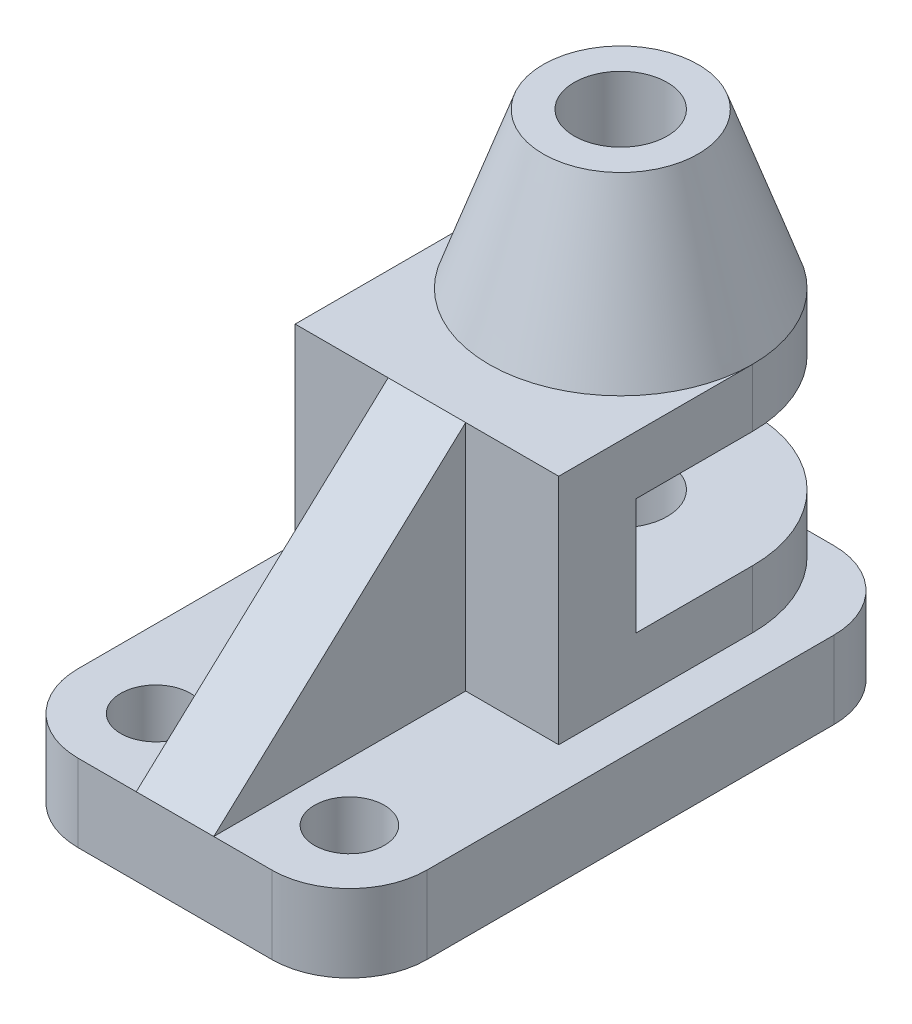
ISO-10303-21;
HEADER;
FILE_DESCRIPTION(('STEP AP214'),'2;1');
FILE_NAME('part.step','',(''),(''),'','','');
FILE_SCHEMA(('AUTOMOTIVE_DESIGN { 1 0 10303 214 1 1 1 1 }'));
ENDSEC;
DATA;
#1=APPLICATION_CONTEXT('core data for automotive mechanical design processes');
#2=APPLICATION_PROTOCOL_DEFINITION('international standard','automotive_design',2000,#1);
#3=PRODUCT_CONTEXT('',#1,'mechanical');
#4=PRODUCT('Part','Part','',(#3));
#5=PRODUCT_RELATED_PRODUCT_CATEGORY('part','',(#4));
#6=PRODUCT_DEFINITION_FORMATION('','',#4);
#7=PRODUCT_DEFINITION_CONTEXT('part definition',#1,'design');
#8=PRODUCT_DEFINITION('design','',#6,#7);
#9=PRODUCT_DEFINITION_SHAPE('','',#8);
#10=(LENGTH_UNIT() NAMED_UNIT(*) SI_UNIT(.MILLI.,.METRE.));
#11=(NAMED_UNIT(*) PLANE_ANGLE_UNIT() SI_UNIT($,.RADIAN.));
#12=(NAMED_UNIT(*) SI_UNIT($,.STERADIAN.) SOLID_ANGLE_UNIT());
#13=UNCERTAINTY_MEASURE_WITH_UNIT(LENGTH_MEASURE(1.E-05),#10,'distance_accuracy_value','');
#14=(GEOMETRIC_REPRESENTATION_CONTEXT(3) GLOBAL_UNCERTAINTY_ASSIGNED_CONTEXT((#13)) GLOBAL_UNIT_ASSIGNED_CONTEXT((#10,
#11,#12)) REPRESENTATION_CONTEXT('',''));
#15=CARTESIAN_POINT('',(0.,0.,0.));
#16=DIRECTION('',(0.,0.,1.));
#17=DIRECTION('',(1.,0.,0.));
#18=AXIS2_PLACEMENT_3D('',#15,#16,#17);
#19=CARTESIAN_POINT('',(0.,10.,0.));
#20=DIRECTION('',(0.,-1.,0.));
#21=DIRECTION('',(0.,0.,-1.));
#22=AXIS2_PLACEMENT_3D('',#19,#20,#21);
#23=PLANE('',#22);
#24=CARTESIAN_POINT('',(-25.,10.,52.5));
#25=DIRECTION('',(0.,-1.,0.));
#26=DIRECTION('',(0.,0.,1.));
#27=AXIS2_PLACEMENT_3D('',#24,#25,#26);
#28=CIRCLE('',#27,9.);
#29=CARTESIAN_POINT('',(-25.,10.,61.5));
#30=VERTEX_POINT('',#29);
#31=EDGE_CURVE('E358',#30,#30,#28,.T.);
#32=ORIENTED_EDGE('',*,*,#31,.T.);
#33=EDGE_LOOP('',(#32));
#34=FACE_BOUND('',#33,.T.);
#35=DIRECTION('',(0.,0.,-1.));
#36=VECTOR('',#35,1.);
#37=CARTESIAN_POINT('',(-10.,10.,72.5));
#38=LINE('',#37,#36);
#39=CARTESIAN_POINT('',(-10.,10.,72.5));
#40=VERTEX_POINT('',#39);
#41=CARTESIAN_POINT('',(-10.,10.,7.49999999999997));
#42=VERTEX_POINT('',#41);
#43=EDGE_CURVE('E343',#40,#42,#38,.T.);
#44=ORIENTED_EDGE('',*,*,#43,.T.);
#45=DIRECTION('',(1.,0.,0.));
#46=VECTOR('',#45,1.);
#47=CARTESIAN_POINT('',(-34.,10.,7.49999999999997));
#48=LINE('',#47,#46);
#49=CARTESIAN_POINT('',(-34.,10.,7.49999999999997));
#50=VERTEX_POINT('',#49);
#51=EDGE_CURVE('E282',#50,#42,#48,.T.);
#52=ORIENTED_EDGE('',*,*,#51,.F.);
#53=DIRECTION('',(0.,0.,1.));
#54=VECTOR('',#53,1.);
#55=CARTESIAN_POINT('',(-34.,10.,7.49999999999997));
#56=LINE('',#55,#54);
#57=CARTESIAN_POINT('',(-34.,10.,-42.5));
#58=VERTEX_POINT('',#57);
#59=EDGE_CURVE('E278',#58,#50,#56,.T.);
#60=ORIENTED_EDGE('',*,*,#59,.F.);
#61=CARTESIAN_POINT('',(0.,10.,-42.5));
#62=DIRECTION('',(0.,1.,0.));
#63=DIRECTION('',(0.,0.,1.));
#64=AXIS2_PLACEMENT_3D('',#61,#62,#63);
#65=CIRCLE('',#64,34.);
#66=CARTESIAN_POINT('',(-16.,10.,-72.5));
#67=VERTEX_POINT('',#66);
#68=EDGE_CURVE('E50',#67,#58,#65,.T.);
#69=ORIENTED_EDGE('',*,*,#68,.F.);
#70=DIRECTION('',(-1.,0.,0.));
#71=VECTOR('',#70,1.);
#72=CARTESIAN_POINT('',(45.,10.,-72.5));
#73=LINE('',#72,#71);
#74=CARTESIAN_POINT('',(-25.,10.,-72.5));
#75=VERTEX_POINT('',#74);
#76=EDGE_CURVE('E233',#67,#75,#73,.T.);
#77=ORIENTED_EDGE('',*,*,#76,.T.);
#78=CARTESIAN_POINT('',(-25.,10.,-52.5));
#79=DIRECTION('',(0.,-1.,0.));
#80=DIRECTION('',(0.,0.,-1.));
#81=AXIS2_PLACEMENT_3D('',#78,#79,#80);
#82=CIRCLE('',#81,20.);
#83=CARTESIAN_POINT('',(-45.,10.,-52.5));
#84=VERTEX_POINT('',#83);
#85=EDGE_CURVE('E256',#75,#84,#82,.F.);
#86=ORIENTED_EDGE('',*,*,#85,.T.);
#87=DIRECTION('',(0.,0.,1.));
#88=VECTOR('',#87,1.);
#89=CARTESIAN_POINT('',(-45.,10.,72.5));
#90=LINE('',#89,#88);
#91=CARTESIAN_POINT('',(-45.,10.,52.5));
#92=VERTEX_POINT('',#91);
#93=EDGE_CURVE('E210',#84,#92,#90,.T.);
#94=ORIENTED_EDGE('',*,*,#93,.T.);
#95=CARTESIAN_POINT('',(-25.,10.,52.5));
#96=DIRECTION('',(0.,-1.,0.));
#97=DIRECTION('',(0.,0.,-1.));
#98=AXIS2_PLACEMENT_3D('',#95,#96,#97);
#99=CIRCLE('',#98,20.);
#100=CARTESIAN_POINT('',(-25.,10.,72.5));
#101=VERTEX_POINT('',#100);
#102=EDGE_CURVE('E252',#92,#101,#99,.F.);
#103=ORIENTED_EDGE('',*,*,#102,.T.);
#104=DIRECTION('',(1.,0.,0.));
#105=VECTOR('',#104,1.);
#106=CARTESIAN_POINT('',(45.,10.,72.5));
#107=LINE('',#106,#105);
#108=EDGE_CURVE('E209',#101,#40,#107,.T.);
#109=ORIENTED_EDGE('',*,*,#108,.T.);
#110=EDGE_LOOP('',(#44,#52,#60,#69,#77,#86,#94,#103,#109));
#111=FACE_BOUND('',#110,.T.);
#112=ADVANCED_FACE('F41',(#34,#111),#23,.F.);
#113=CARTESIAN_POINT('',(-34.,70.,7.49999999999997));
#114=DIRECTION('',(0.,0.,-1.));
#115=DIRECTION('',(-1.,0.,0.));
#116=AXIS2_PLACEMENT_3D('',#113,#114,#115);
#117=PLANE('',#116);
#118=DIRECTION('',(0.,1.,0.));
#119=VECTOR('',#118,1.);
#120=CARTESIAN_POINT('',(-10.,70.,7.49999999999997));
#121=LINE('',#120,#119);
#122=CARTESIAN_POINT('',(-10.,70.,7.49999999999997));
#123=VERTEX_POINT('',#122);
#124=EDGE_CURVE('E347',#42,#123,#121,.T.);
#125=ORIENTED_EDGE('',*,*,#124,.T.);
#126=DIRECTION('',(1.,0.,0.));
#127=VECTOR('',#126,1.);
#128=CARTESIAN_POINT('',(-34.,70.,7.49999999999997));
#129=LINE('',#128,#127);
#130=CARTESIAN_POINT('',(-34.,70.,7.49999999999997));
#131=VERTEX_POINT('',#130);
#132=EDGE_CURVE('E298',#131,#123,#129,.T.);
#133=ORIENTED_EDGE('',*,*,#132,.F.);
#134=DIRECTION('',(0.,-1.,0.));
#135=VECTOR('',#134,1.);
#136=CARTESIAN_POINT('',(-34.,70.,7.49999999999997));
#137=LINE('',#136,#135);
#138=EDGE_CURVE('E291',#131,#50,#137,.T.);
#139=ORIENTED_EDGE('',*,*,#138,.T.);
#140=ORIENTED_EDGE('',*,*,#51,.T.);
#141=EDGE_LOOP('',(#125,#133,#139,#140));
#142=FACE_BOUND('',#141,.T.);
#143=ADVANCED_FACE('F402',(#142),#117,.F.);
#144=CARTESIAN_POINT('',(34.,70.,7.49999999999997));
#145=DIRECTION('',(-1.,0.,0.));
#146=DIRECTION('',(0.,0.,1.));
#147=AXIS2_PLACEMENT_3D('',#144,#145,#146);
#148=PLANE('',#147);
#149=DIRECTION('',(0.,0.,-1.));
#150=VECTOR('',#149,1.);
#151=CARTESIAN_POINT('',(34.,25.,0.));
#152=LINE('',#151,#150);
#153=CARTESIAN_POINT('',(34.,25.,-12.5));
#154=VERTEX_POINT('',#153);
#155=CARTESIAN_POINT('',(34.,25.,-42.5));
#156=VERTEX_POINT('',#155);
#157=EDGE_CURVE('E321',#154,#156,#152,.T.);
#158=ORIENTED_EDGE('',*,*,#157,.F.);
#159=DIRECTION('',(0.,1.,0.));
#160=VECTOR('',#159,1.);
#161=CARTESIAN_POINT('',(34.,25.,-12.5));
#162=LINE('',#161,#160);
#163=CARTESIAN_POINT('',(34.,55.,-12.5));
#164=VERTEX_POINT('',#163);
#165=EDGE_CURVE('E304',#154,#164,#162,.T.);
#166=ORIENTED_EDGE('',*,*,#165,.T.);
#167=DIRECTION('',(0.,0.,-1.));
#168=VECTOR('',#167,1.);
#169=CARTESIAN_POINT('',(34.,55.,0.));
#170=LINE('',#169,#168);
#171=CARTESIAN_POINT('',(34.,55.,-42.5));
#172=VERTEX_POINT('',#171);
#173=EDGE_CURVE('E312',#164,#172,#170,.T.);
#174=ORIENTED_EDGE('',*,*,#173,.T.);
#175=DIRECTION('',(0.,-1.,0.));
#176=VECTOR('',#175,1.);
#177=CARTESIAN_POINT('',(34.,70.,-42.5));
#178=LINE('',#177,#176);
#179=CARTESIAN_POINT('',(34.,70.,-42.5));
#180=VERTEX_POINT('',#179);
#181=EDGE_CURVE('E414',#180,#172,#178,.T.);
#182=ORIENTED_EDGE('',*,*,#181,.F.);
#183=DIRECTION('',(0.,0.,-1.));
#184=VECTOR('',#183,1.);
#185=CARTESIAN_POINT('',(34.,70.,7.49999999999997));
#186=LINE('',#185,#184);
#187=CARTESIAN_POINT('',(34.,70.,7.49999999999997));
#188=VERTEX_POINT('',#187);
#189=EDGE_CURVE('E295',#188,#180,#186,.T.);
#190=ORIENTED_EDGE('',*,*,#189,.F.);
#191=DIRECTION('',(0.,-1.,0.));
#192=VECTOR('',#191,1.);
#193=CARTESIAN_POINT('',(34.,70.,7.49999999999997));
#194=LINE('',#193,#192);
#195=CARTESIAN_POINT('',(34.,10.,7.49999999999997));
#196=VERTEX_POINT('',#195);
#197=EDGE_CURVE('E225',#188,#196,#194,.T.);
#198=ORIENTED_EDGE('',*,*,#197,.T.);
#199=DIRECTION('',(0.,0.,-1.));
#200=VECTOR('',#199,1.);
#201=CARTESIAN_POINT('',(34.,10.,7.49999999999997));
#202=LINE('',#201,#200);
#203=CARTESIAN_POINT('',(34.,10.,-42.5));
#204=VERTEX_POINT('',#203);
#205=EDGE_CURVE('E279',#196,#204,#202,.T.);
#206=ORIENTED_EDGE('',*,*,#205,.T.);
#207=EDGE_CURVE('E413',#156,#204,#178,.T.);
#208=ORIENTED_EDGE('',*,*,#207,.F.);
#209=EDGE_LOOP('',(#158,#166,#174,#182,#190,#198,#206,#208));
#210=FACE_BOUND('',#209,.T.);
#211=ADVANCED_FACE('F444',(#210),#148,.F.);
#212=CARTESIAN_POINT('',(0.,70.,-42.5));
#213=DIRECTION('',(0.,-1.,0.));
#214=DIRECTION('',(0.,0.,-1.));
#215=AXIS2_PLACEMENT_3D('',#212,#213,#214);
#216=CYLINDRICAL_SURFACE('',#215,34.);
#217=CARTESIAN_POINT('',(0.,25.,-42.5));
#218=DIRECTION('',(0.,1.,0.));
#219=DIRECTION('',(0.,0.,1.));
#220=AXIS2_PLACEMENT_3D('',#217,#218,#219);
#221=CIRCLE('',#220,34.);
#222=CARTESIAN_POINT('',(-34.,25.,-42.5));
#223=VERTEX_POINT('',#222);
#224=EDGE_CURVE('E305',#156,#223,#221,.T.);
#225=ORIENTED_EDGE('',*,*,#224,.F.);
#226=ORIENTED_EDGE('',*,*,#207,.T.);
#227=CARTESIAN_POINT('',(16.,10.,-72.5));
#228=VERTEX_POINT('',#227);
#229=EDGE_CURVE('E270',#204,#228,#65,.T.);
#230=ORIENTED_EDGE('',*,*,#229,.T.);
#231=EDGE_CURVE('E271',#228,#67,#65,.T.);
#232=ORIENTED_EDGE('',*,*,#231,.T.);
#233=ORIENTED_EDGE('',*,*,#68,.T.);
#234=DIRECTION('',(0.,-1.,0.));
#235=VECTOR('',#234,1.);
#236=CARTESIAN_POINT('',(-34.,70.,-42.5));
#237=LINE('',#236,#235);
#238=EDGE_CURVE('E407',#223,#58,#237,.T.);
#239=ORIENTED_EDGE('',*,*,#238,.F.);
#240=EDGE_LOOP('',(#225,#226,#230,#232,#233,#239));
#241=FACE_BOUND('',#240,.T.);
#242=ADVANCED_FACE('F456',(#241),#216,.T.);
#243=CARTESIAN_POINT('',(-34.,70.,7.49999999999997));
#244=DIRECTION('',(1.,0.,0.));
#245=DIRECTION('',(0.,0.,-1.));
#246=AXIS2_PLACEMENT_3D('',#243,#244,#245);
#247=PLANE('',#246);
#248=DIRECTION('',(0.,0.,1.));
#249=VECTOR('',#248,1.);
#250=CARTESIAN_POINT('',(-34.,25.,0.));
#251=LINE('',#250,#249);
#252=CARTESIAN_POINT('',(-34.,25.,-12.5));
#253=VERTEX_POINT('',#252);
#254=EDGE_CURVE('E311',#223,#253,#251,.T.);
#255=ORIENTED_EDGE('',*,*,#254,.F.);
#256=ORIENTED_EDGE('',*,*,#238,.T.);
#257=ORIENTED_EDGE('',*,*,#59,.T.);
#258=ORIENTED_EDGE('',*,*,#138,.F.);
#259=DIRECTION('',(0.,0.,1.));
#260=VECTOR('',#259,1.);
#261=CARTESIAN_POINT('',(-34.,70.,7.49999999999997));
#262=LINE('',#261,#260);
#263=CARTESIAN_POINT('',(-34.,70.,-42.5));
#264=VERTEX_POINT('',#263);
#265=EDGE_CURVE('E289',#264,#131,#262,.T.);
#266=ORIENTED_EDGE('',*,*,#265,.F.);
#267=CARTESIAN_POINT('',(-34.,55.,-42.5));
#268=VERTEX_POINT('',#267);
#269=EDGE_CURVE('E409',#264,#268,#237,.T.);
#270=ORIENTED_EDGE('',*,*,#269,.T.);
#271=DIRECTION('',(0.,0.,1.));
#272=VECTOR('',#271,1.);
#273=CARTESIAN_POINT('',(-34.,55.,0.));
#274=LINE('',#273,#272);
#275=CARTESIAN_POINT('',(-34.,55.,-12.5));
#276=VERTEX_POINT('',#275);
#277=EDGE_CURVE('E316',#268,#276,#274,.T.);
#278=ORIENTED_EDGE('',*,*,#277,.T.);
#279=DIRECTION('',(0.,1.,0.));
#280=VECTOR('',#279,1.);
#281=CARTESIAN_POINT('',(-34.,25.,-12.5));
#282=LINE('',#281,#280);
#283=EDGE_CURVE('E302',#253,#276,#282,.T.);
#284=ORIENTED_EDGE('',*,*,#283,.F.);
#285=EDGE_LOOP('',(#255,#256,#257,#258,#266,#270,#278,#284));
#286=FACE_BOUND('',#285,.T.);
#287=ADVANCED_FACE('F448',(#286),#247,.F.);
#288=CARTESIAN_POINT('',(25.,10.,52.5));
#289=DIRECTION('',(0.,1.,0.));
#290=DIRECTION('',(0.,0.,1.));
#291=AXIS2_PLACEMENT_3D('',#288,#289,#290);
#292=CIRCLE('',#291,9.);
#293=CARTESIAN_POINT('',(25.,10.,61.5));
#294=VERTEX_POINT('',#293);
#295=EDGE_CURVE('E352',#294,#294,#292,.T.);
#296=ORIENTED_EDGE('',*,*,#295,.F.);
#297=EDGE_LOOP('',(#296));
#298=FACE_BOUND('',#297,.T.);
#299=CARTESIAN_POINT('',(10.,10.,7.49999999999997));
#300=VERTEX_POINT('',#299);
#301=EDGE_CURVE('E203',#300,#196,#48,.T.);
#302=ORIENTED_EDGE('',*,*,#301,.F.);
#303=DIRECTION('',(0.,0.,-1.));
#304=VECTOR('',#303,1.);
#305=CARTESIAN_POINT('',(10.,10.,72.5));
#306=LINE('',#305,#304);
#307=CARTESIAN_POINT('',(10.,10.,72.5));
#308=VERTEX_POINT('',#307);
#309=EDGE_CURVE('E181',#308,#300,#306,.T.);
#310=ORIENTED_EDGE('',*,*,#309,.F.);
#311=CARTESIAN_POINT('',(25.,10.,72.5));
#312=VERTEX_POINT('',#311);
#313=EDGE_CURVE('E200',#308,#312,#107,.T.);
#314=ORIENTED_EDGE('',*,*,#313,.T.);
#315=CARTESIAN_POINT('',(25.,10.,52.5));
#316=DIRECTION('',(0.,-1.,0.));
#317=DIRECTION('',(0.,0.,-1.));
#318=AXIS2_PLACEMENT_3D('',#315,#316,#317);
#319=CIRCLE('',#318,20.);
#320=CARTESIAN_POINT('',(45.,10.,52.5));
#321=VERTEX_POINT('',#320);
#322=EDGE_CURVE('E254',#312,#321,#319,.F.);
#323=ORIENTED_EDGE('',*,*,#322,.T.);
#324=DIRECTION('',(0.,0.,-1.));
#325=VECTOR('',#324,1.);
#326=CARTESIAN_POINT('',(45.,10.,72.5));
#327=LINE('',#326,#325);
#328=CARTESIAN_POINT('',(45.,10.,-52.5));
#329=VERTEX_POINT('',#328);
#330=EDGE_CURVE('E212',#321,#329,#327,.T.);
#331=ORIENTED_EDGE('',*,*,#330,.T.);
#332=CARTESIAN_POINT('',(25.,10.,-52.5));
#333=DIRECTION('',(0.,-1.,0.));
#334=DIRECTION('',(0.,0.,-1.));
#335=AXIS2_PLACEMENT_3D('',#332,#333,#334);
#336=CIRCLE('',#335,20.);
#337=CARTESIAN_POINT('',(25.,10.,-72.5));
#338=VERTEX_POINT('',#337);
#339=EDGE_CURVE('E258',#329,#338,#336,.F.);
#340=ORIENTED_EDGE('',*,*,#339,.T.);
#341=EDGE_CURVE('E214',#338,#228,#73,.T.);
#342=ORIENTED_EDGE('',*,*,#341,.T.);
#343=ORIENTED_EDGE('',*,*,#229,.F.);
#344=ORIENTED_EDGE('',*,*,#205,.F.);
#345=EDGE_LOOP('',(#302,#310,#314,#323,#331,#340,#342,#343,#344));
#346=FACE_BOUND('',#345,.T.);
#347=ADVANCED_FACE('F199',(#298,#346),#23,.F.);
#348=CARTESIAN_POINT('',(45.,10.,-72.5));
#349=DIRECTION('',(0.,0.,1.));
#350=DIRECTION('',(1.,0.,0.));
#351=AXIS2_PLACEMENT_3D('',#348,#349,#350);
#352=PLANE('',#351);
#353=ORIENTED_EDGE('',*,*,#341,.F.);
#354=DIRECTION('',(0.,-1.,0.));
#355=VECTOR('',#354,1.);
#356=CARTESIAN_POINT('',(25.,10.,-72.5));
#357=LINE('',#356,#355);
#358=CARTESIAN_POINT('',(25.,-10.,-72.5));
#359=VERTEX_POINT('',#358);
#360=EDGE_CURVE('E236',#338,#359,#357,.T.);
#361=ORIENTED_EDGE('',*,*,#360,.T.);
#362=DIRECTION('',(-1.,0.,0.));
#363=VECTOR('',#362,1.);
#364=CARTESIAN_POINT('',(45.,-10.,-72.5));
#365=LINE('',#364,#363);
#366=CARTESIAN_POINT('',(-25.,-10.,-72.5));
#367=VERTEX_POINT('',#366);
#368=EDGE_CURVE('E221',#359,#367,#365,.T.);
#369=ORIENTED_EDGE('',*,*,#368,.T.);
#370=DIRECTION('',(0.,-1.,0.));
#371=VECTOR('',#370,1.);
#372=CARTESIAN_POINT('',(-25.,10.,-72.5));
#373=LINE('',#372,#371);
#374=EDGE_CURVE('E220',#367,#75,#373,.F.);
#375=ORIENTED_EDGE('',*,*,#374,.T.);
#376=ORIENTED_EDGE('',*,*,#76,.F.);
#377=EDGE_CURVE('E418',#228,#67,#73,.T.);
#378=ORIENTED_EDGE('',*,*,#377,.F.);
#379=EDGE_LOOP('',(#353,#361,#369,#375,#376,#378));
#380=FACE_BOUND('',#379,.T.);
#381=ADVANCED_FACE('F383',(#380),#352,.F.);
#382=CARTESIAN_POINT('',(-45.,10.,72.5));
#383=DIRECTION('',(1.,0.,0.));
#384=DIRECTION('',(0.,0.,-1.));
#385=AXIS2_PLACEMENT_3D('',#382,#383,#384);
#386=PLANE('',#385);
#387=ORIENTED_EDGE('',*,*,#93,.F.);
#388=DIRECTION('',(0.,-1.,0.));
#389=VECTOR('',#388,1.);
#390=CARTESIAN_POINT('',(-45.,10.,-52.5));
#391=LINE('',#390,#389);
#392=CARTESIAN_POINT('',(-45.,-10.,-52.5));
#393=VERTEX_POINT('',#392);
#394=EDGE_CURVE('E262',#84,#393,#391,.T.);
#395=ORIENTED_EDGE('',*,*,#394,.T.);
#396=DIRECTION('',(0.,0.,1.));
#397=VECTOR('',#396,1.);
#398=CARTESIAN_POINT('',(-45.,-10.,72.5));
#399=LINE('',#398,#397);
#400=CARTESIAN_POINT('',(-45.,-10.,52.5));
#401=VERTEX_POINT('',#400);
#402=EDGE_CURVE('E224',#393,#401,#399,.T.);
#403=ORIENTED_EDGE('',*,*,#402,.T.);
#404=DIRECTION('',(0.,-1.,0.));
#405=VECTOR('',#404,1.);
#406=CARTESIAN_POINT('',(-45.,10.,52.5));
#407=LINE('',#406,#405);
#408=EDGE_CURVE('E260',#401,#92,#407,.F.);
#409=ORIENTED_EDGE('',*,*,#408,.T.);
#410=EDGE_LOOP('',(#387,#395,#403,#409));
#411=FACE_BOUND('',#410,.T.);
#412=ADVANCED_FACE('F394',(#411),#386,.F.);
#413=CARTESIAN_POINT('',(45.,10.,72.5));
#414=DIRECTION('',(0.,0.,-1.));
#415=DIRECTION('',(-1.,0.,0.));
#416=AXIS2_PLACEMENT_3D('',#413,#414,#415);
#417=PLANE('',#416);
#418=DIRECTION('',(1.,0.,0.));
#419=VECTOR('',#418,1.);
#420=CARTESIAN_POINT('',(45.,-10.,72.5));
#421=LINE('',#420,#419);
#422=CARTESIAN_POINT('',(-25.,-10.,72.5));
#423=VERTEX_POINT('',#422);
#424=CARTESIAN_POINT('',(25.,-10.,72.5));
#425=VERTEX_POINT('',#424);
#426=EDGE_CURVE('E228',#423,#425,#421,.T.);
#427=ORIENTED_EDGE('',*,*,#426,.T.);
#428=DIRECTION('',(0.,-1.,0.));
#429=VECTOR('',#428,1.);
#430=CARTESIAN_POINT('',(25.,10.,72.5));
#431=LINE('',#430,#429);
#432=EDGE_CURVE('E45',#425,#312,#431,.F.);
#433=ORIENTED_EDGE('',*,*,#432,.T.);
#434=ORIENTED_EDGE('',*,*,#313,.F.);
#435=DIRECTION('',(-1.,0.,0.));
#436=VECTOR('',#435,1.);
#437=CARTESIAN_POINT('',(10.,10.,72.5));
#438=LINE('',#437,#436);
#439=EDGE_CURVE('E187',#308,#40,#438,.T.);
#440=ORIENTED_EDGE('',*,*,#439,.T.);
#441=ORIENTED_EDGE('',*,*,#108,.F.);
#442=DIRECTION('',(0.,-1.,0.));
#443=VECTOR('',#442,1.);
#444=CARTESIAN_POINT('',(-25.,10.,72.5));
#445=LINE('',#444,#443);
#446=EDGE_CURVE('E264',#101,#423,#445,.T.);
#447=ORIENTED_EDGE('',*,*,#446,.T.);
#448=EDGE_LOOP('',(#427,#433,#434,#440,#441,#447));
#449=FACE_BOUND('',#448,.T.);
#450=ADVANCED_FACE('F206',(#449),#417,.F.);
#451=CARTESIAN_POINT('',(45.,10.,72.5));
#452=DIRECTION('',(-1.,0.,0.));
#453=DIRECTION('',(0.,0.,1.));
#454=AXIS2_PLACEMENT_3D('',#451,#452,#453);
#455=PLANE('',#454);
#456=DIRECTION('',(0.,0.,-1.));
#457=VECTOR('',#456,1.);
#458=CARTESIAN_POINT('',(45.,-10.,72.5));
#459=LINE('',#458,#457);
#460=CARTESIAN_POINT('',(45.,-10.,52.5));
#461=VERTEX_POINT('',#460);
#462=CARTESIAN_POINT('',(45.,-10.,-52.5));
#463=VERTEX_POINT('',#462);
#464=EDGE_CURVE('E230',#461,#463,#459,.T.);
#465=ORIENTED_EDGE('',*,*,#464,.T.);
#466=DIRECTION('',(0.,-1.,0.));
#467=VECTOR('',#466,1.);
#468=CARTESIAN_POINT('',(45.,10.,-52.5));
#469=LINE('',#468,#467);
#470=EDGE_CURVE('E250',#463,#329,#469,.F.);
#471=ORIENTED_EDGE('',*,*,#470,.T.);
#472=ORIENTED_EDGE('',*,*,#330,.F.);
#473=DIRECTION('',(0.,-1.,0.));
#474=VECTOR('',#473,1.);
#475=CARTESIAN_POINT('',(45.,10.,52.5));
#476=LINE('',#475,#474);
#477=EDGE_CURVE('E247',#321,#461,#476,.T.);
#478=ORIENTED_EDGE('',*,*,#477,.T.);
#479=EDGE_LOOP('',(#465,#471,#472,#478));
#480=FACE_BOUND('',#479,.T.);
#481=ADVANCED_FACE('F371',(#480),#455,.F.);
#482=CARTESIAN_POINT('',(0.,-10.,0.));
#483=DIRECTION('',(0.,-1.,0.));
#484=DIRECTION('',(0.,0.,-1.));
#485=AXIS2_PLACEMENT_3D('',#482,#483,#484);
#486=PLANE('',#485);
#487=CARTESIAN_POINT('',(-25.,-10.,52.5));
#488=DIRECTION('',(0.,-1.,0.));
#489=DIRECTION('',(0.,0.,1.));
#490=AXIS2_PLACEMENT_3D('',#487,#488,#489);
#491=CIRCLE('',#490,9.);
#492=CARTESIAN_POINT('',(-25.,-10.,61.5));
#493=VERTEX_POINT('',#492);
#494=EDGE_CURVE('E355',#493,#493,#491,.T.);
#495=ORIENTED_EDGE('',*,*,#494,.F.);
#496=EDGE_LOOP('',(#495));
#497=FACE_BOUND('',#496,.T.);
#498=CARTESIAN_POINT('',(25.,-10.,52.5));
#499=DIRECTION('',(0.,1.,0.));
#500=DIRECTION('',(0.,0.,1.));
#501=AXIS2_PLACEMENT_3D('',#498,#499,#500);
#502=CIRCLE('',#501,9.);
#503=CARTESIAN_POINT('',(25.,-10.,61.5));
#504=VERTEX_POINT('',#503);
#505=EDGE_CURVE('E349',#504,#504,#502,.T.);
#506=ORIENTED_EDGE('',*,*,#505,.T.);
#507=EDGE_LOOP('',(#506));
#508=FACE_BOUND('',#507,.T.);
#509=CARTESIAN_POINT('',(0.,-10.,-42.5));
#510=DIRECTION('',(0.,-1.,0.));
#511=DIRECTION('',(0.,0.,-1.));
#512=AXIS2_PLACEMENT_3D('',#509,#510,#511);
#513=CIRCLE('',#512,12.);
#514=CARTESIAN_POINT('',(0.,-10.,-54.5));
#515=VERTEX_POINT('',#514);
#516=EDGE_CURVE('E329',#515,#515,#513,.T.);
#517=ORIENTED_EDGE('',*,*,#516,.F.);
#518=EDGE_LOOP('',(#517));
#519=FACE_BOUND('',#518,.T.);
#520=ORIENTED_EDGE('',*,*,#368,.F.);
#521=CARTESIAN_POINT('',(25.,-10.,-52.5));
#522=DIRECTION('',(0.,-1.,0.));
#523=DIRECTION('',(0.,0.,-1.));
#524=AXIS2_PLACEMENT_3D('',#521,#522,#523);
#525=CIRCLE('',#524,20.);
#526=EDGE_CURVE('E245',#359,#463,#525,.T.);
#527=ORIENTED_EDGE('',*,*,#526,.T.);
#528=ORIENTED_EDGE('',*,*,#464,.F.);
#529=CARTESIAN_POINT('',(25.,-10.,52.5));
#530=DIRECTION('',(0.,-1.,0.));
#531=DIRECTION('',(0.,0.,-1.));
#532=AXIS2_PLACEMENT_3D('',#529,#530,#531);
#533=CIRCLE('',#532,20.);
#534=EDGE_CURVE('E241',#461,#425,#533,.T.);
#535=ORIENTED_EDGE('',*,*,#534,.T.);
#536=ORIENTED_EDGE('',*,*,#426,.F.);
#537=CARTESIAN_POINT('',(-25.,-10.,52.5));
#538=DIRECTION('',(0.,-1.,0.));
#539=DIRECTION('',(0.,0.,-1.));
#540=AXIS2_PLACEMENT_3D('',#537,#538,#539);
#541=CIRCLE('',#540,20.);
#542=EDGE_CURVE('E239',#423,#401,#541,.T.);
#543=ORIENTED_EDGE('',*,*,#542,.T.);
#544=ORIENTED_EDGE('',*,*,#402,.F.);
#545=CARTESIAN_POINT('',(-25.,-10.,-52.5));
#546=DIRECTION('',(0.,-1.,0.));
#547=DIRECTION('',(0.,0.,-1.));
#548=AXIS2_PLACEMENT_3D('',#545,#546,#547);
#549=CIRCLE('',#548,20.);
#550=EDGE_CURVE('E243',#393,#367,#549,.T.);
#551=ORIENTED_EDGE('',*,*,#550,.T.);
#552=EDGE_LOOP('',(#520,#527,#528,#535,#536,#543,#544,#551));
#553=FACE_BOUND('',#552,.T.);
#554=ADVANCED_FACE('F367',(#497,#508,#519,#553),#486,.T.);
#555=CARTESIAN_POINT('',(25.,10.,-52.5));
#556=DIRECTION('',(0.,-1.,0.));
#557=DIRECTION('',(0.,0.,-1.));
#558=AXIS2_PLACEMENT_3D('',#555,#556,#557);
#559=CYLINDRICAL_SURFACE('',#558,20.);
#560=ORIENTED_EDGE('',*,*,#339,.F.);
#561=ORIENTED_EDGE('',*,*,#470,.F.);
#562=ORIENTED_EDGE('',*,*,#526,.F.);
#563=ORIENTED_EDGE('',*,*,#360,.F.);
#564=EDGE_LOOP('',(#560,#561,#562,#563));
#565=FACE_BOUND('',#564,.T.);
#566=ADVANCED_FACE('F370',(#565),#559,.T.);
#567=CARTESIAN_POINT('',(-25.,10.,-52.5));
#568=DIRECTION('',(0.,-1.,0.));
#569=DIRECTION('',(0.,0.,-1.));
#570=AXIS2_PLACEMENT_3D('',#567,#568,#569);
#571=CYLINDRICAL_SURFACE('',#570,20.);
#572=ORIENTED_EDGE('',*,*,#85,.F.);
#573=ORIENTED_EDGE('',*,*,#374,.F.);
#574=ORIENTED_EDGE('',*,*,#550,.F.);
#575=ORIENTED_EDGE('',*,*,#394,.F.);
#576=EDGE_LOOP('',(#572,#573,#574,#575));
#577=FACE_BOUND('',#576,.T.);
#578=ADVANCED_FACE('F388',(#577),#571,.T.);
#579=CARTESIAN_POINT('',(25.,10.,52.5));
#580=DIRECTION('',(0.,-1.,0.));
#581=DIRECTION('',(0.,0.,-1.));
#582=AXIS2_PLACEMENT_3D('',#579,#580,#581);
#583=CYLINDRICAL_SURFACE('',#582,20.);
#584=ORIENTED_EDGE('',*,*,#322,.F.);
#585=ORIENTED_EDGE('',*,*,#432,.F.);
#586=ORIENTED_EDGE('',*,*,#534,.F.);
#587=ORIENTED_EDGE('',*,*,#477,.F.);
#588=EDGE_LOOP('',(#584,#585,#586,#587));
#589=FACE_BOUND('',#588,.T.);
#590=ADVANCED_FACE('F430',(#589),#583,.T.);
#591=CARTESIAN_POINT('',(-25.,10.,52.5));
#592=DIRECTION('',(0.,-1.,0.));
#593=DIRECTION('',(0.,0.,-1.));
#594=AXIS2_PLACEMENT_3D('',#591,#592,#593);
#595=CYLINDRICAL_SURFACE('',#594,20.);
#596=ORIENTED_EDGE('',*,*,#102,.F.);
#597=ORIENTED_EDGE('',*,*,#408,.F.);
#598=ORIENTED_EDGE('',*,*,#542,.F.);
#599=ORIENTED_EDGE('',*,*,#446,.F.);
#600=EDGE_LOOP('',(#596,#597,#598,#599));
#601=FACE_BOUND('',#600,.T.);
#602=ADVANCED_FACE('F43',(#601),#595,.T.);
#603=CARTESIAN_POINT('',(0.,10.,-42.5));
#604=DIRECTION('',(0.,1.,0.));
#605=DIRECTION('',(0.,0.,1.));
#606=AXIS2_PLACEMENT_3D('',#603,#604,#605);
#607=PLANE('',#606);
#608=ORIENTED_EDGE('',*,*,#231,.F.);
#609=ORIENTED_EDGE('',*,*,#377,.T.);
#610=EDGE_LOOP('',(#608,#609));
#611=FACE_BOUND('',#610,.T.);
#612=ADVANCED_FACE('F422',(#611),#607,.F.);
#613=CARTESIAN_POINT('',(10.,70.,7.49999999999997));
#614=VERTEX_POINT('',#613);
#615=EDGE_CURVE('E301',#614,#188,#129,.T.);
#616=ORIENTED_EDGE('',*,*,#615,.F.);
#617=DIRECTION('',(0.,1.,0.));
#618=VECTOR('',#617,1.);
#619=CARTESIAN_POINT('',(10.,70.,7.49999999999997));
#620=LINE('',#619,#618);
#621=EDGE_CURVE('E58',#300,#614,#620,.T.);
#622=ORIENTED_EDGE('',*,*,#621,.F.);
#623=ORIENTED_EDGE('',*,*,#301,.T.);
#624=ORIENTED_EDGE('',*,*,#197,.F.);
#625=EDGE_LOOP('',(#616,#622,#623,#624));
#626=FACE_BOUND('',#625,.T.);
#627=ADVANCED_FACE('F446',(#626),#117,.F.);
#628=ORIENTED_EDGE('',*,*,#181,.T.);
#629=CARTESIAN_POINT('',(0.,55.,-42.5));
#630=DIRECTION('',(0.,1.,0.));
#631=DIRECTION('',(0.,0.,1.));
#632=AXIS2_PLACEMENT_3D('',#629,#630,#631);
#633=CIRCLE('',#632,34.);
#634=EDGE_CURVE('E308',#172,#268,#633,.T.);
#635=ORIENTED_EDGE('',*,*,#634,.T.);
#636=ORIENTED_EDGE('',*,*,#269,.F.);
#637=CARTESIAN_POINT('',(0.,70.,-42.5));
#638=DIRECTION('',(0.,1.,0.));
#639=DIRECTION('',(0.,0.,1.));
#640=AXIS2_PLACEMENT_3D('',#637,#638,#639);
#641=CIRCLE('',#640,34.);
#642=EDGE_CURVE('E292',#180,#264,#641,.T.);
#643=ORIENTED_EDGE('',*,*,#642,.F.);
#644=EDGE_LOOP('',(#628,#635,#636,#643));
#645=FACE_BOUND('',#644,.T.);
#646=ADVANCED_FACE('F502',(#645),#216,.T.);
#647=CARTESIAN_POINT('',(0.,70.,-42.5));
#648=DIRECTION('',(0.,1.,0.));
#649=DIRECTION('',(0.,0.,1.));
#650=AXIS2_PLACEMENT_3D('',#647,#648,#649);
#651=PLANE('',#650);
#652=CARTESIAN_POINT('',(0.,70.,-42.5));
#653=DIRECTION('',(0.,1.,0.));
#654=DIRECTION('',(0.,0.,1.));
#655=AXIS2_PLACEMENT_3D('',#652,#653,#654);
#656=CIRCLE('',#655,34.);
#657=EDGE_CURVE('E11',#264,#180,#656,.T.);
#658=ORIENTED_EDGE('',*,*,#657,.F.);
#659=ORIENTED_EDGE('',*,*,#265,.T.);
#660=ORIENTED_EDGE('',*,*,#132,.T.);
#661=DIRECTION('',(-1.,0.,0.));
#662=VECTOR('',#661,1.);
#663=CARTESIAN_POINT('',(10.,70.,7.49999999999997));
#664=LINE('',#663,#662);
#665=EDGE_CURVE('E195',#614,#123,#664,.T.);
#666=ORIENTED_EDGE('',*,*,#665,.F.);
#667=ORIENTED_EDGE('',*,*,#615,.T.);
#668=ORIENTED_EDGE('',*,*,#189,.T.);
#669=EDGE_LOOP('',(#658,#659,#660,#666,#667,#668));
#670=FACE_BOUND('',#669,.T.);
#671=ADVANCED_FACE('F498',(#670),#651,.T.);
#672=CARTESIAN_POINT('',(0.,25.,-12.5));
#673=DIRECTION('',(0.,0.,1.));
#674=DIRECTION('',(1.,0.,0.));
#675=AXIS2_PLACEMENT_3D('',#672,#673,#674);
#676=PLANE('',#675);
#677=DIRECTION('',(1.,0.,0.));
#678=VECTOR('',#677,1.);
#679=CARTESIAN_POINT('',(0.,55.,-12.5));
#680=LINE('',#679,#678);
#681=EDGE_CURVE('E66',#276,#164,#680,.T.);
#682=ORIENTED_EDGE('',*,*,#681,.T.);
#683=ORIENTED_EDGE('',*,*,#165,.F.);
#684=DIRECTION('',(1.,0.,0.));
#685=VECTOR('',#684,1.);
#686=CARTESIAN_POINT('',(0.,25.,-12.5));
#687=LINE('',#686,#685);
#688=EDGE_CURVE('E323',#253,#154,#687,.T.);
#689=ORIENTED_EDGE('',*,*,#688,.F.);
#690=ORIENTED_EDGE('',*,*,#283,.T.);
#691=EDGE_LOOP('',(#682,#683,#689,#690));
#692=FACE_BOUND('',#691,.T.);
#693=ADVANCED_FACE('F491',(#692),#676,.F.);
#694=CARTESIAN_POINT('',(0.,25.,0.));
#695=DIRECTION('',(0.,1.,0.));
#696=DIRECTION('',(0.,0.,1.));
#697=AXIS2_PLACEMENT_3D('',#694,#695,#696);
#698=PLANE('',#697);
#699=CARTESIAN_POINT('',(0.,25.,-42.5));
#700=DIRECTION('',(0.,1.,0.));
#701=DIRECTION('',(0.,0.,1.));
#702=AXIS2_PLACEMENT_3D('',#699,#700,#701);
#703=CIRCLE('',#702,12.);
#704=CARTESIAN_POINT('',(0.,25.,-30.5));
#705=VERTEX_POINT('',#704);
#706=EDGE_CURVE('E333',#705,#705,#703,.T.);
#707=ORIENTED_EDGE('',*,*,#706,.F.);
#708=EDGE_LOOP('',(#707));
#709=FACE_BOUND('',#708,.T.);
#710=ORIENTED_EDGE('',*,*,#254,.T.);
#711=ORIENTED_EDGE('',*,*,#688,.T.);
#712=ORIENTED_EDGE('',*,*,#157,.T.);
#713=ORIENTED_EDGE('',*,*,#224,.T.);
#714=EDGE_LOOP('',(#710,#711,#712,#713));
#715=FACE_BOUND('',#714,.T.);
#716=ADVANCED_FACE('F488',(#709,#715),#698,.T.);
#717=CARTESIAN_POINT('',(0.,55.,0.));
#718=DIRECTION('',(0.,1.,0.));
#719=DIRECTION('',(0.,0.,1.));
#720=AXIS2_PLACEMENT_3D('',#717,#718,#719);
#721=PLANE('',#720);
#722=CARTESIAN_POINT('',(0.,55.,-42.5));
#723=DIRECTION('',(0.,1.,0.));
#724=DIRECTION('',(0.,0.,1.));
#725=AXIS2_PLACEMENT_3D('',#722,#723,#724);
#726=CIRCLE('',#725,12.);
#727=CARTESIAN_POINT('',(0.,55.,-30.5));
#728=VERTEX_POINT('',#727);
#729=EDGE_CURVE('E336',#728,#728,#726,.T.);
#730=ORIENTED_EDGE('',*,*,#729,.T.);
#731=EDGE_LOOP('',(#730));
#732=FACE_BOUND('',#731,.T.);
#733=ORIENTED_EDGE('',*,*,#277,.F.);
#734=ORIENTED_EDGE('',*,*,#634,.F.);
#735=ORIENTED_EDGE('',*,*,#173,.F.);
#736=ORIENTED_EDGE('',*,*,#681,.F.);
#737=EDGE_LOOP('',(#733,#734,#735,#736));
#738=FACE_BOUND('',#737,.T.);
#739=ADVANCED_FACE('F486',(#732,#738),#721,.F.);
#740=CARTESIAN_POINT('',(0.,110.,-42.5));
#741=DIRECTION('',(0.,-1.,0.));
#742=DIRECTION('',(0.,0.,-1.));
#743=AXIS2_PLACEMENT_3D('',#740,#741,#742);
#744=PLANE('',#743);
#745=CARTESIAN_POINT('',(0.,110.,-42.5));
#746=DIRECTION('',(0.,1.,0.));
#747=DIRECTION('',(0.,0.,1.));
#748=AXIS2_PLACEMENT_3D('',#745,#746,#747);
#749=CIRCLE('',#748,12.);
#750=CARTESIAN_POINT('',(0.,110.,-30.5));
#751=VERTEX_POINT('',#750);
#752=EDGE_CURVE('E339',#751,#751,#749,.T.);
#753=ORIENTED_EDGE('',*,*,#752,.F.);
#754=EDGE_LOOP('',(#753));
#755=FACE_BOUND('',#754,.T.);
#756=CARTESIAN_POINT('',(0.,110.,-42.5));
#757=DIRECTION('',(0.,1.,0.));
#758=DIRECTION('',(0.,0.,1.));
#759=AXIS2_PLACEMENT_3D('',#756,#757,#758);
#760=CIRCLE('',#759,20.);
#761=CARTESIAN_POINT('',(0.,110.,-22.5));
#762=VERTEX_POINT('',#761);
#763=EDGE_CURVE('E319',#762,#762,#760,.T.);
#764=ORIENTED_EDGE('',*,*,#763,.T.);
#765=EDGE_LOOP('',(#764));
#766=FACE_BOUND('',#765,.T.);
#767=ADVANCED_FACE('F482',(#755,#766),#744,.F.);
#768=CARTESIAN_POINT('',(0.,70.,-42.5));
#769=DIRECTION('',(0.,-1.,0.));
#770=DIRECTION('',(0.,0.,-1.));
#771=AXIS2_PLACEMENT_3D('',#768,#769,#770);
#772=CONICAL_SURFACE('',#771,34.,0.336674819386727);
#773=ORIENTED_EDGE('',*,*,#763,.F.);
#774=EDGE_LOOP('',(#773));
#775=FACE_BOUND('',#774,.T.);
#776=ORIENTED_EDGE('',*,*,#642,.T.);
#777=ORIENTED_EDGE('',*,*,#657,.T.);
#778=EDGE_LOOP('',(#776,#777));
#779=FACE_BOUND('',#778,.T.);
#780=ADVANCED_FACE('F479',(#775,#779),#772,.T.);
#781=CARTESIAN_POINT('',(0.,-17.0000000000001,-42.5));
#782=DIRECTION('',(0.,1.,0.));
#783=DIRECTION('',(0.,0.,1.));
#784=AXIS2_PLACEMENT_3D('',#781,#782,#783);
#785=CYLINDRICAL_SURFACE('',#784,12.);
#786=ORIENTED_EDGE('',*,*,#752,.T.);
#787=EDGE_LOOP('',(#786));
#788=FACE_BOUND('',#787,.T.);
#789=ORIENTED_EDGE('',*,*,#729,.F.);
#790=EDGE_LOOP('',(#789));
#791=FACE_BOUND('',#790,.T.);
#792=ADVANCED_FACE('F477',(#788,#791),#785,.F.);
#793=ORIENTED_EDGE('',*,*,#516,.T.);
#794=EDGE_LOOP('',(#793));
#795=FACE_BOUND('',#794,.T.);
#796=ORIENTED_EDGE('',*,*,#706,.T.);
#797=EDGE_LOOP('',(#796));
#798=FACE_BOUND('',#797,.T.);
#799=ADVANCED_FACE('F474',(#795,#798),#785,.F.);
#800=CARTESIAN_POINT('',(10.,70.,7.49999999999997));
#801=DIRECTION('',(0.,-0.734803444627488,-0.678280102733066));
#802=DIRECTION('',(0.,0.678280102733066,-0.734803444627488));
#803=AXIS2_PLACEMENT_3D('',#800,#801,#802);
#804=PLANE('',#803);
#805=DIRECTION('',(0.,-0.678280102733066,0.734803444627488));
#806=VECTOR('',#805,1.);
#807=CARTESIAN_POINT('',(-10.,70.,7.49999999999997));
#808=LINE('',#807,#806);
#809=EDGE_CURVE('E189',#123,#40,#808,.T.);
#810=ORIENTED_EDGE('',*,*,#809,.T.);
#811=ORIENTED_EDGE('',*,*,#439,.F.);
#812=DIRECTION('',(0.,-0.678280102733066,0.734803444627488));
#813=VECTOR('',#812,1.);
#814=CARTESIAN_POINT('',(10.,70.,7.49999999999997));
#815=LINE('',#814,#813);
#816=EDGE_CURVE('E177',#614,#308,#815,.T.);
#817=ORIENTED_EDGE('',*,*,#816,.F.);
#818=ORIENTED_EDGE('',*,*,#665,.T.);
#819=EDGE_LOOP('',(#810,#811,#817,#818));
#820=FACE_BOUND('',#819,.T.);
#821=ADVANCED_FACE('F188',(#820),#804,.F.);
#822=CARTESIAN_POINT('',(10.,0.,0.));
#823=DIRECTION('',(1.,0.,0.));
#824=DIRECTION('',(0.,0.,-1.));
#825=AXIS2_PLACEMENT_3D('',#822,#823,#824);
#826=PLANE('',#825);
#827=ORIENTED_EDGE('',*,*,#621,.T.);
#828=ORIENTED_EDGE('',*,*,#816,.T.);
#829=ORIENTED_EDGE('',*,*,#309,.T.);
#830=EDGE_LOOP('',(#827,#828,#829));
#831=FACE_BOUND('',#830,.T.);
#832=ADVANCED_FACE('F179',(#831),#826,.T.);
#833=CARTESIAN_POINT('',(-10.,0.,0.));
#834=DIRECTION('',(1.,0.,0.));
#835=DIRECTION('',(0.,0.,-1.));
#836=AXIS2_PLACEMENT_3D('',#833,#834,#835);
#837=PLANE('',#836);
#838=ORIENTED_EDGE('',*,*,#124,.F.);
#839=ORIENTED_EDGE('',*,*,#43,.F.);
#840=ORIENTED_EDGE('',*,*,#809,.F.);
#841=EDGE_LOOP('',(#838,#839,#840));
#842=FACE_BOUND('',#841,.T.);
#843=ADVANCED_FACE('F461',(#842),#837,.F.);
#844=CARTESIAN_POINT('',(25.,-10.,52.5));
#845=DIRECTION('',(0.,1.,0.));
#846=DIRECTION('',(0.,0.,1.));
#847=AXIS2_PLACEMENT_3D('',#844,#845,#846);
#848=CYLINDRICAL_SURFACE('',#847,9.);
#849=ORIENTED_EDGE('',*,*,#505,.F.);
#850=EDGE_LOOP('',(#849));
#851=FACE_BOUND('',#850,.T.);
#852=ORIENTED_EDGE('',*,*,#295,.T.);
#853=EDGE_LOOP('',(#852));
#854=FACE_BOUND('',#853,.T.);
#855=ADVANCED_FACE('F460',(#851,#854),#848,.F.);
#856=CARTESIAN_POINT('',(-25.,-10.,52.5));
#857=DIRECTION('',(0.,1.,0.));
#858=DIRECTION('',(0.,0.,1.));
#859=AXIS2_PLACEMENT_3D('',#856,#857,#858);
#860=CYLINDRICAL_SURFACE('',#859,9.);
#861=ORIENTED_EDGE('',*,*,#494,.T.);
#862=EDGE_LOOP('',(#861));
#863=FACE_BOUND('',#862,.T.);
#864=ORIENTED_EDGE('',*,*,#31,.F.);
#865=EDGE_LOOP('',(#864));
#866=FACE_BOUND('',#865,.T.);
#867=ADVANCED_FACE('F364',(#863,#866),#860,.F.);
#868=CLOSED_SHELL('',(#112,#143,#211,#242,#287,#347,#381,#412,#450,#481,#554,#566,#578,#590,
#602,#612,#627,#646,#671,#693,#716,#739,#767,#780,#792,#799,#821,#832,#843,#855,#867));
#869=MANIFOLD_SOLID_BREP('B2',#868);
#870=ADVANCED_BREP_SHAPE_REPRESENTATION('',(#18,#869),#14);
#871=SHAPE_DEFINITION_REPRESENTATION(#9,#870);
ENDSEC;
END-ISO-10303-21;
